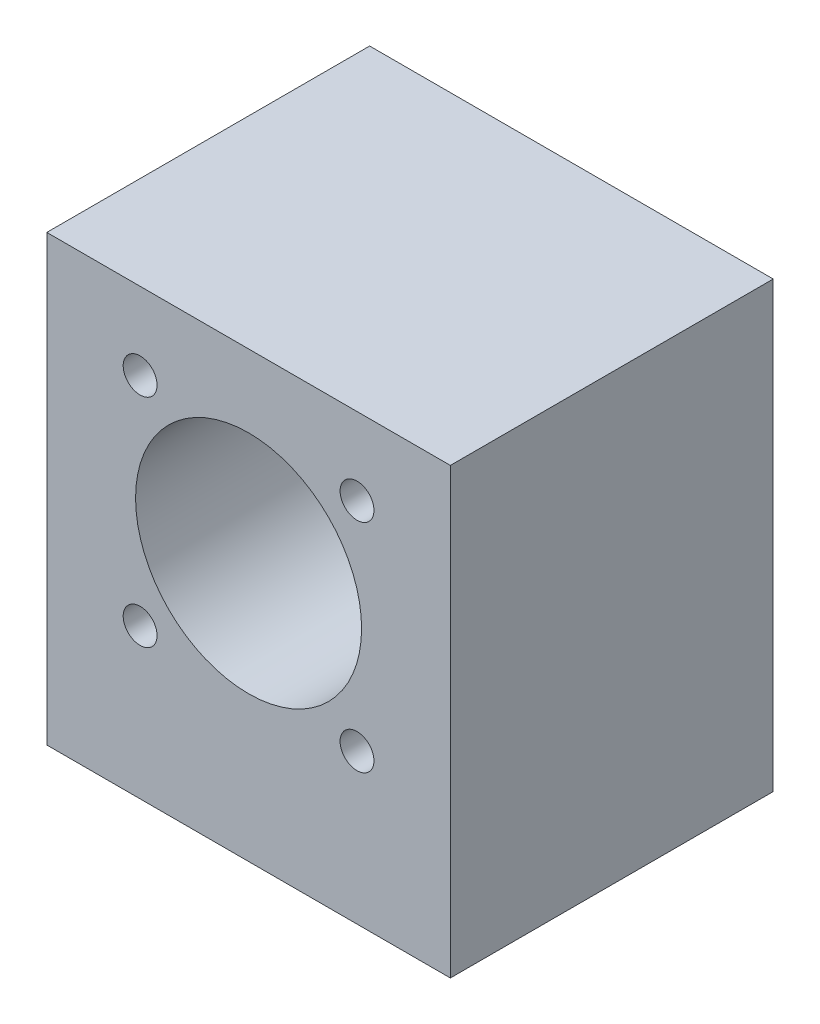
ISO-10303-21;
HEADER;
FILE_DESCRIPTION(('STEP AP214'),'2;1');
FILE_NAME('part.step','',(''),(''),'','','');
FILE_SCHEMA(('AUTOMOTIVE_DESIGN { 1 0 10303 214 1 1 1 1 }'));
ENDSEC;
DATA;
#1=APPLICATION_CONTEXT('core data for automotive mechanical design processes');
#2=APPLICATION_PROTOCOL_DEFINITION('international standard','automotive_design',2000,#1);
#3=PRODUCT_CONTEXT('',#1,'mechanical');
#4=PRODUCT('Part','Part','',(#3));
#5=PRODUCT_RELATED_PRODUCT_CATEGORY('part','',(#4));
#6=PRODUCT_DEFINITION_FORMATION('','',#4);
#7=PRODUCT_DEFINITION_CONTEXT('part definition',#1,'design');
#8=PRODUCT_DEFINITION('design','',#6,#7);
#9=PRODUCT_DEFINITION_SHAPE('','',#8);
#10=(LENGTH_UNIT() NAMED_UNIT(*) SI_UNIT(.MILLI.,.METRE.));
#11=(NAMED_UNIT(*) PLANE_ANGLE_UNIT() SI_UNIT($,.RADIAN.));
#12=(NAMED_UNIT(*) SI_UNIT($,.STERADIAN.) SOLID_ANGLE_UNIT());
#13=UNCERTAINTY_MEASURE_WITH_UNIT(LENGTH_MEASURE(1.E-05),#10,'distance_accuracy_value','');
#14=(GEOMETRIC_REPRESENTATION_CONTEXT(3) GLOBAL_UNCERTAINTY_ASSIGNED_CONTEXT((#13)) GLOBAL_UNIT_ASSIGNED_CONTEXT((#10,
#11,#12)) REPRESENTATION_CONTEXT('',''));
#15=CARTESIAN_POINT('',(0.,0.,0.));
#16=DIRECTION('',(0.,0.,1.));
#17=DIRECTION('',(1.,0.,0.));
#18=AXIS2_PLACEMENT_3D('',#15,#16,#17);
#19=CARTESIAN_POINT('',(-25.,-27.5,-40.));
#20=DIRECTION('',(-1.,0.,0.));
#21=DIRECTION('',(0.,0.,1.));
#22=AXIS2_PLACEMENT_3D('',#19,#20,#21);
#23=PLANE('',#22);
#24=DIRECTION('',(0.,-1.,0.));
#25=VECTOR('',#24,1.);
#26=CARTESIAN_POINT('',(-25.,-27.5,0.));
#27=LINE('',#26,#25);
#28=CARTESIAN_POINT('',(-25.,27.5,0.));
#29=VERTEX_POINT('',#28);
#30=CARTESIAN_POINT('',(-25.,-27.5,0.));
#31=VERTEX_POINT('',#30);
#32=EDGE_CURVE('E170',#29,#31,#27,.T.);
#33=ORIENTED_EDGE('',*,*,#32,.F.);
#34=DIRECTION('',(0.,0.,1.));
#35=VECTOR('',#34,1.);
#36=CARTESIAN_POINT('',(-25.,27.5,-40.));
#37=LINE('',#36,#35);
#38=CARTESIAN_POINT('',(-25.,27.5,-40.));
#39=VERTEX_POINT('',#38);
#40=EDGE_CURVE('E11',#39,#29,#37,.T.);
#41=ORIENTED_EDGE('',*,*,#40,.F.);
#42=DIRECTION('',(0.,-1.,0.));
#43=VECTOR('',#42,1.);
#44=CARTESIAN_POINT('',(-25.,-27.5,-40.));
#45=LINE('',#44,#43);
#46=CARTESIAN_POINT('',(-25.,-27.5,-40.));
#47=VERTEX_POINT('',#46);
#48=EDGE_CURVE('E173',#39,#47,#45,.T.);
#49=ORIENTED_EDGE('',*,*,#48,.T.);
#50=DIRECTION('',(0.,0.,1.));
#51=VECTOR('',#50,1.);
#52=CARTESIAN_POINT('',(-25.,-27.5,-40.));
#53=LINE('',#52,#51);
#54=EDGE_CURVE('E42',#47,#31,#53,.T.);
#55=ORIENTED_EDGE('',*,*,#54,.T.);
#56=EDGE_LOOP('',(#33,#41,#49,#55));
#57=FACE_BOUND('',#56,.T.);
#58=ADVANCED_FACE('F39',(#57),#23,.T.);
#59=CARTESIAN_POINT('',(25.,27.5,-40.));
#60=DIRECTION('',(0.,1.,0.));
#61=DIRECTION('',(-1.,0.,0.));
#62=AXIS2_PLACEMENT_3D('',#59,#60,#61);
#63=PLANE('',#62);
#64=DIRECTION('',(-1.,0.,0.));
#65=VECTOR('',#64,1.);
#66=CARTESIAN_POINT('',(25.,27.5,0.));
#67=LINE('',#66,#65);
#68=CARTESIAN_POINT('',(25.,27.5,0.));
#69=VERTEX_POINT('',#68);
#70=EDGE_CURVE('E176',#69,#29,#67,.T.);
#71=ORIENTED_EDGE('',*,*,#70,.F.);
#72=DIRECTION('',(0.,0.,1.));
#73=VECTOR('',#72,1.);
#74=CARTESIAN_POINT('',(25.,27.5,-40.));
#75=LINE('',#74,#73);
#76=CARTESIAN_POINT('',(25.,27.5,-40.));
#77=VERTEX_POINT('',#76);
#78=EDGE_CURVE('E48',#77,#69,#75,.T.);
#79=ORIENTED_EDGE('',*,*,#78,.F.);
#80=DIRECTION('',(-1.,0.,0.));
#81=VECTOR('',#80,1.);
#82=CARTESIAN_POINT('',(25.,27.5,-40.));
#83=LINE('',#82,#81);
#84=EDGE_CURVE('E180',#77,#39,#83,.T.);
#85=ORIENTED_EDGE('',*,*,#84,.T.);
#86=ORIENTED_EDGE('',*,*,#40,.T.);
#87=EDGE_LOOP('',(#71,#79,#85,#86));
#88=FACE_BOUND('',#87,.T.);
#89=ADVANCED_FACE('F195',(#88),#63,.T.);
#90=CARTESIAN_POINT('',(25.,-27.5,-40.));
#91=DIRECTION('',(1.,0.,0.));
#92=DIRECTION('',(0.,0.,-1.));
#93=AXIS2_PLACEMENT_3D('',#90,#91,#92);
#94=PLANE('',#93);
#95=DIRECTION('',(0.,1.,0.));
#96=VECTOR('',#95,1.);
#97=CARTESIAN_POINT('',(25.,-27.5,0.));
#98=LINE('',#97,#96);
#99=CARTESIAN_POINT('',(25.,-27.5,0.));
#100=VERTEX_POINT('',#99);
#101=EDGE_CURVE('E187',#100,#69,#98,.T.);
#102=ORIENTED_EDGE('',*,*,#101,.F.);
#103=DIRECTION('',(0.,0.,1.));
#104=VECTOR('',#103,1.);
#105=CARTESIAN_POINT('',(25.,-27.5,-40.));
#106=LINE('',#105,#104);
#107=CARTESIAN_POINT('',(25.,-27.5,-40.));
#108=VERTEX_POINT('',#107);
#109=EDGE_CURVE('E191',#108,#100,#106,.T.);
#110=ORIENTED_EDGE('',*,*,#109,.F.);
#111=DIRECTION('',(0.,1.,0.));
#112=VECTOR('',#111,1.);
#113=CARTESIAN_POINT('',(25.,-27.5,-40.));
#114=LINE('',#113,#112);
#115=EDGE_CURVE('E178',#108,#77,#114,.T.);
#116=ORIENTED_EDGE('',*,*,#115,.T.);
#117=ORIENTED_EDGE('',*,*,#78,.T.);
#118=EDGE_LOOP('',(#102,#110,#116,#117));
#119=FACE_BOUND('',#118,.T.);
#120=ADVANCED_FACE('F198',(#119),#94,.T.);
#121=CARTESIAN_POINT('',(25.,-27.5,-40.));
#122=DIRECTION('',(0.,-1.,0.));
#123=DIRECTION('',(1.,0.,0.));
#124=AXIS2_PLACEMENT_3D('',#121,#122,#123);
#125=PLANE('',#124);
#126=CARTESIAN_POINT('',(-20.,-27.5,-8.));
#127=DIRECTION('',(0.,-1.,0.));
#128=DIRECTION('',(0.,0.,-1.));
#129=AXIS2_PLACEMENT_3D('',#126,#127,#128);
#130=CIRCLE('',#129,2.1);
#131=CARTESIAN_POINT('',(-20.,-27.5,-10.1));
#132=VERTEX_POINT('',#131);
#133=EDGE_CURVE('E142',#132,#132,#130,.T.);
#134=ORIENTED_EDGE('',*,*,#133,.F.);
#135=EDGE_LOOP('',(#134));
#136=FACE_BOUND('',#135,.T.);
#137=CARTESIAN_POINT('',(20.,-27.5,-7.99999999999999));
#138=DIRECTION('',(0.,-1.,0.));
#139=DIRECTION('',(0.,0.,-1.));
#140=AXIS2_PLACEMENT_3D('',#137,#138,#139);
#141=CIRCLE('',#140,2.1);
#142=CARTESIAN_POINT('',(20.,-27.5,-10.1));
#143=VERTEX_POINT('',#142);
#144=EDGE_CURVE('E148',#143,#143,#141,.T.);
#145=ORIENTED_EDGE('',*,*,#144,.F.);
#146=EDGE_LOOP('',(#145));
#147=FACE_BOUND('',#146,.T.);
#148=CARTESIAN_POINT('',(20.,-27.5,-32.));
#149=DIRECTION('',(0.,-1.,0.));
#150=DIRECTION('',(0.,0.,-1.));
#151=AXIS2_PLACEMENT_3D('',#148,#149,#150);
#152=CIRCLE('',#151,2.1);
#153=CARTESIAN_POINT('',(20.,-27.5,-34.1));
#154=VERTEX_POINT('',#153);
#155=EDGE_CURVE('E154',#154,#154,#152,.T.);
#156=ORIENTED_EDGE('',*,*,#155,.F.);
#157=EDGE_LOOP('',(#156));
#158=FACE_BOUND('',#157,.T.);
#159=CARTESIAN_POINT('',(-20.,-27.5,-32.));
#160=DIRECTION('',(0.,-1.,0.));
#161=DIRECTION('',(0.,0.,-1.));
#162=AXIS2_PLACEMENT_3D('',#159,#160,#161);
#163=CIRCLE('',#162,2.1);
#164=CARTESIAN_POINT('',(-20.,-27.5,-34.1));
#165=VERTEX_POINT('',#164);
#166=EDGE_CURVE('E160',#165,#165,#163,.T.);
#167=ORIENTED_EDGE('',*,*,#166,.F.);
#168=EDGE_LOOP('',(#167));
#169=FACE_BOUND('',#168,.T.);
#170=DIRECTION('',(1.,0.,0.));
#171=VECTOR('',#170,1.);
#172=CARTESIAN_POINT('',(25.,-27.5,0.));
#173=LINE('',#172,#171);
#174=EDGE_CURVE('E184',#31,#100,#173,.T.);
#175=ORIENTED_EDGE('',*,*,#174,.F.);
#176=ORIENTED_EDGE('',*,*,#54,.F.);
#177=DIRECTION('',(1.,0.,0.));
#178=VECTOR('',#177,1.);
#179=CARTESIAN_POINT('',(25.,-27.5,-40.));
#180=LINE('',#179,#178);
#181=EDGE_CURVE('E175',#47,#108,#180,.T.);
#182=ORIENTED_EDGE('',*,*,#181,.T.);
#183=ORIENTED_EDGE('',*,*,#109,.T.);
#184=EDGE_LOOP('',(#175,#176,#182,#183));
#185=FACE_BOUND('',#184,.T.);
#186=ADVANCED_FACE('F192',(#136,#147,#158,#169,#185),#125,.T.);
#187=CARTESIAN_POINT('',(0.,0.,-40.));
#188=DIRECTION('',(0.,0.,1.));
#189=DIRECTION('',(1.,0.,0.));
#190=AXIS2_PLACEMENT_3D('',#187,#188,#189);
#191=PLANE('',#190);
#192=CARTESIAN_POINT('',(0.,4.49999999999999,-40.));
#193=DIRECTION('',(0.,0.,1.));
#194=DIRECTION('',(1.,0.,0.));
#195=AXIS2_PLACEMENT_3D('',#192,#193,#194);
#196=CIRCLE('',#195,14.);
#197=CARTESIAN_POINT('',(14.,4.49999999999999,-40.));
#198=VERTEX_POINT('',#197);
#199=EDGE_CURVE('E167',#198,#198,#196,.T.);
#200=ORIENTED_EDGE('',*,*,#199,.T.);
#201=EDGE_LOOP('',(#200));
#202=FACE_BOUND('',#201,.T.);
#203=ORIENTED_EDGE('',*,*,#48,.F.);
#204=ORIENTED_EDGE('',*,*,#84,.F.);
#205=ORIENTED_EDGE('',*,*,#115,.F.);
#206=ORIENTED_EDGE('',*,*,#181,.F.);
#207=EDGE_LOOP('',(#203,#204,#205,#206));
#208=FACE_BOUND('',#207,.T.);
#209=ADVANCED_FACE('F200',(#202,#208),#191,.F.);
#210=CARTESIAN_POINT('',(0.,0.,0.));
#211=DIRECTION('',(0.,0.,1.));
#212=DIRECTION('',(1.,0.,0.));
#213=AXIS2_PLACEMENT_3D('',#210,#211,#212);
#214=PLANE('',#213);
#215=CARTESIAN_POINT('',(13.4350288425444,17.9350288425444,0.));
#216=DIRECTION('',(0.,0.,1.));
#217=DIRECTION('',(1.,0.,0.));
#218=AXIS2_PLACEMENT_3D('',#215,#216,#217);
#219=CIRCLE('',#218,2.09999999999999);
#220=CARTESIAN_POINT('',(15.5350288425444,17.9350288425444,0.));
#221=VERTEX_POINT('',#220);
#222=EDGE_CURVE('E120',#221,#221,#219,.T.);
#223=ORIENTED_EDGE('',*,*,#222,.F.);
#224=EDGE_LOOP('',(#223));
#225=FACE_BOUND('',#224,.T.);
#226=CARTESIAN_POINT('',(13.4350288425444,-8.93502884254443,0.));
#227=DIRECTION('',(0.,0.,1.));
#228=DIRECTION('',(1.,0.,0.));
#229=AXIS2_PLACEMENT_3D('',#226,#227,#228);
#230=CIRCLE('',#229,2.09999999999999);
#231=CARTESIAN_POINT('',(15.5350288425444,-8.93502884254443,0.));
#232=VERTEX_POINT('',#231);
#233=EDGE_CURVE('E119',#232,#232,#230,.T.);
#234=ORIENTED_EDGE('',*,*,#233,.F.);
#235=EDGE_LOOP('',(#234));
#236=FACE_BOUND('',#235,.T.);
#237=CARTESIAN_POINT('',(-13.4350288425444,-8.93502884254443,0.));
#238=DIRECTION('',(0.,0.,1.));
#239=DIRECTION('',(1.,0.,0.));
#240=AXIS2_PLACEMENT_3D('',#237,#238,#239);
#241=CIRCLE('',#240,2.09999999999999);
#242=CARTESIAN_POINT('',(-11.3350288425444,-8.93502884254443,0.));
#243=VERTEX_POINT('',#242);
#244=EDGE_CURVE('E130',#243,#243,#241,.T.);
#245=ORIENTED_EDGE('',*,*,#244,.F.);
#246=EDGE_LOOP('',(#245));
#247=FACE_BOUND('',#246,.T.);
#248=CARTESIAN_POINT('',(-13.4350288425444,17.9350288425444,0.));
#249=DIRECTION('',(0.,0.,1.));
#250=DIRECTION('',(1.,0.,0.));
#251=AXIS2_PLACEMENT_3D('',#248,#249,#250);
#252=CIRCLE('',#251,2.09999999999999);
#253=CARTESIAN_POINT('',(-11.3350288425444,17.9350288425444,0.));
#254=VERTEX_POINT('',#253);
#255=EDGE_CURVE('E136',#254,#254,#252,.T.);
#256=ORIENTED_EDGE('',*,*,#255,.F.);
#257=EDGE_LOOP('',(#256));
#258=FACE_BOUND('',#257,.T.);
#259=CARTESIAN_POINT('',(0.,4.49999999999999,0.));
#260=DIRECTION('',(0.,0.,1.));
#261=DIRECTION('',(1.,0.,0.));
#262=AXIS2_PLACEMENT_3D('',#259,#260,#261);
#263=CIRCLE('',#262,14.);
#264=CARTESIAN_POINT('',(14.,4.49999999999999,0.));
#265=VERTEX_POINT('',#264);
#266=EDGE_CURVE('E166',#265,#265,#263,.T.);
#267=ORIENTED_EDGE('',*,*,#266,.F.);
#268=EDGE_LOOP('',(#267));
#269=FACE_BOUND('',#268,.T.);
#270=ORIENTED_EDGE('',*,*,#32,.T.);
#271=ORIENTED_EDGE('',*,*,#174,.T.);
#272=ORIENTED_EDGE('',*,*,#101,.T.);
#273=ORIENTED_EDGE('',*,*,#70,.T.);
#274=EDGE_LOOP('',(#270,#271,#272,#273));
#275=FACE_BOUND('',#274,.T.);
#276=ADVANCED_FACE('F194',(#225,#236,#247,#258,#269,#275),#214,.T.);
#277=CARTESIAN_POINT('',(0.,4.49999999999999,-40.));
#278=DIRECTION('',(0.,0.,1.));
#279=DIRECTION('',(1.,0.,0.));
#280=AXIS2_PLACEMENT_3D('',#277,#278,#279);
#281=CYLINDRICAL_SURFACE('',#280,14.);
#282=ORIENTED_EDGE('',*,*,#199,.F.);
#283=EDGE_LOOP('',(#282));
#284=FACE_BOUND('',#283,.T.);
#285=ORIENTED_EDGE('',*,*,#266,.T.);
#286=EDGE_LOOP('',(#285));
#287=FACE_BOUND('',#286,.T.);
#288=ADVANCED_FACE('F208',(#284,#287),#281,.F.);
#289=CARTESIAN_POINT('',(-20.,-12.5,-32.));
#290=DIRECTION('',(0.,-1.,0.));
#291=DIRECTION('',(0.,0.,-1.));
#292=AXIS2_PLACEMENT_3D('',#289,#290,#291);
#293=CONICAL_SURFACE('',#292,2.1,1.02974425867665);
#294=CARTESIAN_POINT('',(-20.,-11.2381927000421,-32.));
#295=VERTEX_POINT('',#294);
#296=VERTEX_LOOP('',#295);
#297=FACE_BOUND('',#296,.T.);
#298=CARTESIAN_POINT('',(-20.,-12.5,-32.));
#299=DIRECTION('',(0.,-1.,0.));
#300=DIRECTION('',(0.,0.,-1.));
#301=AXIS2_PLACEMENT_3D('',#298,#299,#300);
#302=CIRCLE('',#301,2.1);
#303=CARTESIAN_POINT('',(-20.,-12.5,-34.1));
#304=VERTEX_POINT('',#303);
#305=EDGE_CURVE('E163',#304,#304,#302,.T.);
#306=ORIENTED_EDGE('',*,*,#305,.T.);
#307=EDGE_LOOP('',(#306));
#308=FACE_BOUND('',#307,.T.);
#309=ADVANCED_FACE('F238',(#297,#308),#293,.F.);
#310=CARTESIAN_POINT('',(-20.,-27.5,-32.));
#311=DIRECTION('',(0.,-1.,0.));
#312=DIRECTION('',(0.,0.,-1.));
#313=AXIS2_PLACEMENT_3D('',#310,#311,#312);
#314=CYLINDRICAL_SURFACE('',#313,2.1);
#315=ORIENTED_EDGE('',*,*,#305,.F.);
#316=EDGE_LOOP('',(#315));
#317=FACE_BOUND('',#316,.T.);
#318=ORIENTED_EDGE('',*,*,#166,.T.);
#319=EDGE_LOOP('',(#318));
#320=FACE_BOUND('',#319,.T.);
#321=ADVANCED_FACE('F243',(#317,#320),#314,.F.);
#322=CARTESIAN_POINT('',(20.,-12.5,-32.));
#323=DIRECTION('',(0.,-1.,0.));
#324=DIRECTION('',(0.,0.,-1.));
#325=AXIS2_PLACEMENT_3D('',#322,#323,#324);
#326=CONICAL_SURFACE('',#325,2.1,1.02974425867665);
#327=CARTESIAN_POINT('',(20.,-11.2381927000421,-32.));
#328=VERTEX_POINT('',#327);
#329=VERTEX_LOOP('',#328);
#330=FACE_BOUND('',#329,.T.);
#331=CARTESIAN_POINT('',(20.,-12.5,-32.));
#332=DIRECTION('',(0.,-1.,0.));
#333=DIRECTION('',(0.,0.,-1.));
#334=AXIS2_PLACEMENT_3D('',#331,#332,#333);
#335=CIRCLE('',#334,2.1);
#336=CARTESIAN_POINT('',(20.,-12.5,-34.1));
#337=VERTEX_POINT('',#336);
#338=EDGE_CURVE('E157',#337,#337,#335,.T.);
#339=ORIENTED_EDGE('',*,*,#338,.T.);
#340=EDGE_LOOP('',(#339));
#341=FACE_BOUND('',#340,.T.);
#342=ADVANCED_FACE('F254',(#330,#341),#326,.F.);
#343=CARTESIAN_POINT('',(20.,-27.5,-32.));
#344=DIRECTION('',(0.,-1.,0.));
#345=DIRECTION('',(0.,0.,-1.));
#346=AXIS2_PLACEMENT_3D('',#343,#344,#345);
#347=CYLINDRICAL_SURFACE('',#346,2.1);
#348=ORIENTED_EDGE('',*,*,#338,.F.);
#349=EDGE_LOOP('',(#348));
#350=FACE_BOUND('',#349,.T.);
#351=ORIENTED_EDGE('',*,*,#155,.T.);
#352=EDGE_LOOP('',(#351));
#353=FACE_BOUND('',#352,.T.);
#354=ADVANCED_FACE('F266',(#350,#353),#347,.F.);
#355=CARTESIAN_POINT('',(20.,-12.5,-7.99999999999999));
#356=DIRECTION('',(0.,-1.,0.));
#357=DIRECTION('',(0.,0.,-1.));
#358=AXIS2_PLACEMENT_3D('',#355,#356,#357);
#359=CONICAL_SURFACE('',#358,2.1,1.02974425867665);
#360=CARTESIAN_POINT('',(20.,-11.2381927000421,-7.99999999999999));
#361=VERTEX_POINT('',#360);
#362=VERTEX_LOOP('',#361);
#363=FACE_BOUND('',#362,.T.);
#364=CARTESIAN_POINT('',(20.,-12.5,-7.99999999999999));
#365=DIRECTION('',(0.,-1.,0.));
#366=DIRECTION('',(0.,0.,-1.));
#367=AXIS2_PLACEMENT_3D('',#364,#365,#366);
#368=CIRCLE('',#367,2.1);
#369=CARTESIAN_POINT('',(20.,-12.5,-10.1));
#370=VERTEX_POINT('',#369);
#371=EDGE_CURVE('E151',#370,#370,#368,.T.);
#372=ORIENTED_EDGE('',*,*,#371,.T.);
#373=EDGE_LOOP('',(#372));
#374=FACE_BOUND('',#373,.T.);
#375=ADVANCED_FACE('F276',(#363,#374),#359,.F.);
#376=CARTESIAN_POINT('',(20.,-27.5,-7.99999999999999));
#377=DIRECTION('',(0.,-1.,0.));
#378=DIRECTION('',(0.,0.,-1.));
#379=AXIS2_PLACEMENT_3D('',#376,#377,#378);
#380=CYLINDRICAL_SURFACE('',#379,2.1);
#381=ORIENTED_EDGE('',*,*,#371,.F.);
#382=EDGE_LOOP('',(#381));
#383=FACE_BOUND('',#382,.T.);
#384=ORIENTED_EDGE('',*,*,#144,.T.);
#385=EDGE_LOOP('',(#384));
#386=FACE_BOUND('',#385,.T.);
#387=ADVANCED_FACE('F288',(#383,#386),#380,.F.);
#388=CARTESIAN_POINT('',(-20.,-12.5,-8.));
#389=DIRECTION('',(0.,-1.,0.));
#390=DIRECTION('',(0.,0.,-1.));
#391=AXIS2_PLACEMENT_3D('',#388,#389,#390);
#392=CONICAL_SURFACE('',#391,2.1,1.02974425867665);
#393=CARTESIAN_POINT('',(-20.,-11.2381927000421,-8.));
#394=VERTEX_POINT('',#393);
#395=VERTEX_LOOP('',#394);
#396=FACE_BOUND('',#395,.T.);
#397=CARTESIAN_POINT('',(-20.,-12.5,-8.));
#398=DIRECTION('',(0.,-1.,0.));
#399=DIRECTION('',(0.,0.,-1.));
#400=AXIS2_PLACEMENT_3D('',#397,#398,#399);
#401=CIRCLE('',#400,2.1);
#402=CARTESIAN_POINT('',(-20.,-12.5,-10.1));
#403=VERTEX_POINT('',#402);
#404=EDGE_CURVE('E145',#403,#403,#401,.T.);
#405=ORIENTED_EDGE('',*,*,#404,.T.);
#406=EDGE_LOOP('',(#405));
#407=FACE_BOUND('',#406,.T.);
#408=ADVANCED_FACE('F298',(#396,#407),#392,.F.);
#409=CARTESIAN_POINT('',(-20.,-27.5,-8.));
#410=DIRECTION('',(0.,-1.,0.));
#411=DIRECTION('',(0.,0.,-1.));
#412=AXIS2_PLACEMENT_3D('',#409,#410,#411);
#413=CYLINDRICAL_SURFACE('',#412,2.1);
#414=ORIENTED_EDGE('',*,*,#404,.F.);
#415=EDGE_LOOP('',(#414));
#416=FACE_BOUND('',#415,.T.);
#417=ORIENTED_EDGE('',*,*,#133,.T.);
#418=EDGE_LOOP('',(#417));
#419=FACE_BOUND('',#418,.T.);
#420=ADVANCED_FACE('F310',(#416,#419),#413,.F.);
#421=CARTESIAN_POINT('',(-13.4350288425444,17.9350288425444,-17.4));
#422=DIRECTION('',(0.,0.,1.));
#423=DIRECTION('',(1.,0.,0.));
#424=AXIS2_PLACEMENT_3D('',#421,#422,#423);
#425=CONICAL_SURFACE('',#424,2.09999999999999,1.02974425867665);
#426=CARTESIAN_POINT('',(-13.4350288425444,17.9350288425444,-18.6618072999579));
#427=VERTEX_POINT('',#426);
#428=VERTEX_LOOP('',#427);
#429=FACE_BOUND('',#428,.T.);
#430=CARTESIAN_POINT('',(-13.4350288425444,17.9350288425444,-17.4));
#431=DIRECTION('',(0.,0.,1.));
#432=DIRECTION('',(1.,0.,0.));
#433=AXIS2_PLACEMENT_3D('',#430,#431,#432);
#434=CIRCLE('',#433,2.09999999999999);
#435=CARTESIAN_POINT('',(-11.3350288425444,17.9350288425444,-17.4));
#436=VERTEX_POINT('',#435);
#437=EDGE_CURVE('E139',#436,#436,#434,.T.);
#438=ORIENTED_EDGE('',*,*,#437,.T.);
#439=EDGE_LOOP('',(#438));
#440=FACE_BOUND('',#439,.T.);
#441=ADVANCED_FACE('F320',(#429,#440),#425,.F.);
#442=CARTESIAN_POINT('',(-13.4350288425444,17.9350288425444,0.));
#443=DIRECTION('',(0.,0.,1.));
#444=DIRECTION('',(1.,0.,0.));
#445=AXIS2_PLACEMENT_3D('',#442,#443,#444);
#446=CYLINDRICAL_SURFACE('',#445,2.09999999999999);
#447=ORIENTED_EDGE('',*,*,#437,.F.);
#448=EDGE_LOOP('',(#447));
#449=FACE_BOUND('',#448,.T.);
#450=ORIENTED_EDGE('',*,*,#255,.T.);
#451=EDGE_LOOP('',(#450));
#452=FACE_BOUND('',#451,.T.);
#453=ADVANCED_FACE('F337',(#449,#452),#446,.F.);
#454=CARTESIAN_POINT('',(-13.4350288425444,-8.93502884254443,-17.4));
#455=DIRECTION('',(0.,0.,1.));
#456=DIRECTION('',(1.,0.,0.));
#457=AXIS2_PLACEMENT_3D('',#454,#455,#456);
#458=CONICAL_SURFACE('',#457,2.09999999999999,1.02974425867665);
#459=CARTESIAN_POINT('',(-13.4350288425444,-8.93502884254443,-18.6618072999579));
#460=VERTEX_POINT('',#459);
#461=VERTEX_LOOP('',#460);
#462=FACE_BOUND('',#461,.T.);
#463=CARTESIAN_POINT('',(-13.4350288425444,-8.93502884254443,-17.4));
#464=DIRECTION('',(0.,0.,1.));
#465=DIRECTION('',(1.,0.,0.));
#466=AXIS2_PLACEMENT_3D('',#463,#464,#465);
#467=CIRCLE('',#466,2.09999999999999);
#468=CARTESIAN_POINT('',(-11.3350288425444,-8.93502884254443,-17.4));
#469=VERTEX_POINT('',#468);
#470=EDGE_CURVE('E133',#469,#469,#467,.T.);
#471=ORIENTED_EDGE('',*,*,#470,.T.);
#472=EDGE_LOOP('',(#471));
#473=FACE_BOUND('',#472,.T.);
#474=ADVANCED_FACE('F347',(#462,#473),#458,.F.);
#475=CARTESIAN_POINT('',(-13.4350288425444,-8.93502884254443,0.));
#476=DIRECTION('',(0.,0.,1.));
#477=DIRECTION('',(1.,0.,0.));
#478=AXIS2_PLACEMENT_3D('',#475,#476,#477);
#479=CYLINDRICAL_SURFACE('',#478,2.09999999999999);
#480=ORIENTED_EDGE('',*,*,#470,.F.);
#481=EDGE_LOOP('',(#480));
#482=FACE_BOUND('',#481,.T.);
#483=ORIENTED_EDGE('',*,*,#244,.T.);
#484=EDGE_LOOP('',(#483));
#485=FACE_BOUND('',#484,.T.);
#486=ADVANCED_FACE('F357',(#482,#485),#479,.F.);
#487=CARTESIAN_POINT('',(13.4350288425444,-8.93502884254443,-17.4));
#488=DIRECTION('',(0.,0.,1.));
#489=DIRECTION('',(1.,0.,0.));
#490=AXIS2_PLACEMENT_3D('',#487,#488,#489);
#491=CONICAL_SURFACE('',#490,2.09999999999999,1.02974425867665);
#492=CARTESIAN_POINT('',(13.4350288425444,-8.93502884254443,-18.6618072999579));
#493=VERTEX_POINT('',#492);
#494=VERTEX_LOOP('',#493);
#495=FACE_BOUND('',#494,.T.);
#496=CARTESIAN_POINT('',(13.4350288425444,-8.93502884254443,-17.4));
#497=DIRECTION('',(0.,0.,1.));
#498=DIRECTION('',(1.,0.,0.));
#499=AXIS2_PLACEMENT_3D('',#496,#497,#498);
#500=CIRCLE('',#499,2.09999999999999);
#501=CARTESIAN_POINT('',(15.5350288425444,-8.93502884254443,-17.4));
#502=VERTEX_POINT('',#501);
#503=EDGE_CURVE('E123',#502,#502,#500,.T.);
#504=ORIENTED_EDGE('',*,*,#503,.T.);
#505=EDGE_LOOP('',(#504));
#506=FACE_BOUND('',#505,.T.);
#507=ADVANCED_FACE('F367',(#495,#506),#491,.F.);
#508=CARTESIAN_POINT('',(13.4350288425444,-8.93502884254443,0.));
#509=DIRECTION('',(0.,0.,1.));
#510=DIRECTION('',(1.,0.,0.));
#511=AXIS2_PLACEMENT_3D('',#508,#509,#510);
#512=CYLINDRICAL_SURFACE('',#511,2.09999999999999);
#513=ORIENTED_EDGE('',*,*,#503,.F.);
#514=EDGE_LOOP('',(#513));
#515=FACE_BOUND('',#514,.T.);
#516=ORIENTED_EDGE('',*,*,#233,.T.);
#517=EDGE_LOOP('',(#516));
#518=FACE_BOUND('',#517,.T.);
#519=ADVANCED_FACE('F113',(#515,#518),#512,.F.);
#520=CARTESIAN_POINT('',(13.4350288425444,17.9350288425444,-17.4));
#521=DIRECTION('',(0.,0.,1.));
#522=DIRECTION('',(1.,0.,0.));
#523=AXIS2_PLACEMENT_3D('',#520,#521,#522);
#524=CONICAL_SURFACE('',#523,2.09999999999999,1.02974425867665);
#525=CARTESIAN_POINT('',(13.4350288425444,17.9350288425444,-18.6618072999579));
#526=VERTEX_POINT('',#525);
#527=VERTEX_LOOP('',#526);
#528=FACE_BOUND('',#527,.T.);
#529=CARTESIAN_POINT('',(13.4350288425444,17.9350288425444,-17.4));
#530=DIRECTION('',(0.,0.,1.));
#531=DIRECTION('',(1.,0.,0.));
#532=AXIS2_PLACEMENT_3D('',#529,#530,#531);
#533=CIRCLE('',#532,2.09999999999999);
#534=CARTESIAN_POINT('',(15.5350288425444,17.9350288425444,-17.4));
#535=VERTEX_POINT('',#534);
#536=EDGE_CURVE('E117',#535,#535,#533,.T.);
#537=ORIENTED_EDGE('',*,*,#536,.T.);
#538=EDGE_LOOP('',(#537));
#539=FACE_BOUND('',#538,.T.);
#540=ADVANCED_FACE('F109',(#528,#539),#524,.F.);
#541=CARTESIAN_POINT('',(13.4350288425444,17.9350288425444,0.));
#542=DIRECTION('',(0.,0.,1.));
#543=DIRECTION('',(1.,0.,0.));
#544=AXIS2_PLACEMENT_3D('',#541,#542,#543);
#545=CYLINDRICAL_SURFACE('',#544,2.09999999999999);
#546=ORIENTED_EDGE('',*,*,#536,.F.);
#547=EDGE_LOOP('',(#546));
#548=FACE_BOUND('',#547,.T.);
#549=ORIENTED_EDGE('',*,*,#222,.T.);
#550=EDGE_LOOP('',(#549));
#551=FACE_BOUND('',#550,.T.);
#552=ADVANCED_FACE('F112',(#548,#551),#545,.F.);
#553=CLOSED_SHELL('',(#58,#89,#120,#186,#209,#276,#288,#309,#321,#342,#354,#375,#387,#408,#420,
#441,#453,#474,#486,#507,#519,#540,#552));
#554=MANIFOLD_SOLID_BREP('B2',#553);
#555=ADVANCED_BREP_SHAPE_REPRESENTATION('',(#18,#554),#14);
#556=SHAPE_DEFINITION_REPRESENTATION(#9,#555);
ENDSEC;
END-ISO-10303-21;
